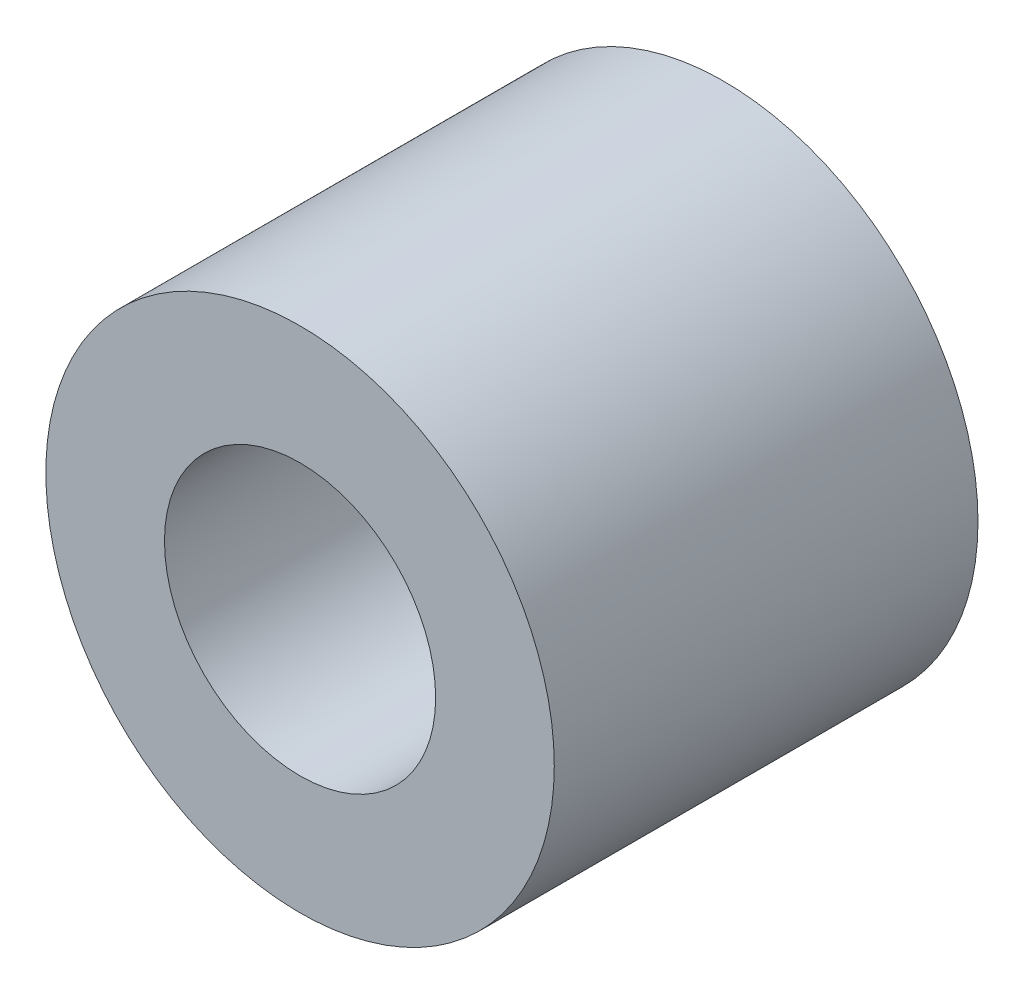
ISO-10303-21;
HEADER;
FILE_DESCRIPTION(('STEP AP214'),'2;1');
FILE_NAME('part.step','',(''),(''),'','','');
FILE_SCHEMA(('AUTOMOTIVE_DESIGN { 1 0 10303 214 1 1 1 1 }'));
ENDSEC;
DATA;
#1=APPLICATION_CONTEXT('core data for automotive mechanical design processes');
#2=APPLICATION_PROTOCOL_DEFINITION('international standard','automotive_design',2000,#1);
#3=PRODUCT_CONTEXT('',#1,'mechanical');
#4=PRODUCT('Part','Part','',(#3));
#5=PRODUCT_RELATED_PRODUCT_CATEGORY('part','',(#4));
#6=PRODUCT_DEFINITION_FORMATION('','',#4);
#7=PRODUCT_DEFINITION_CONTEXT('part definition',#1,'design');
#8=PRODUCT_DEFINITION('design','',#6,#7);
#9=PRODUCT_DEFINITION_SHAPE('','',#8);
#10=(LENGTH_UNIT() NAMED_UNIT(*) SI_UNIT(.MILLI.,.METRE.));
#11=(NAMED_UNIT(*) PLANE_ANGLE_UNIT() SI_UNIT($,.RADIAN.));
#12=(NAMED_UNIT(*) SI_UNIT($,.STERADIAN.) SOLID_ANGLE_UNIT());
#13=UNCERTAINTY_MEASURE_WITH_UNIT(LENGTH_MEASURE(1.E-05),#10,'distance_accuracy_value','');
#14=(GEOMETRIC_REPRESENTATION_CONTEXT(3) GLOBAL_UNCERTAINTY_ASSIGNED_CONTEXT((#13)) GLOBAL_UNIT_ASSIGNED_CONTEXT((#10,
#11,#12)) REPRESENTATION_CONTEXT('',''));
#15=CARTESIAN_POINT('',(0.,0.,0.));
#16=DIRECTION('',(0.,0.,1.));
#17=DIRECTION('',(1.,0.,0.));
#18=AXIS2_PLACEMENT_3D('',#15,#16,#17);
#19=CARTESIAN_POINT('',(0.,0.,5.));
#20=DIRECTION('',(0.,0.,1.));
#21=DIRECTION('',(1.,0.,0.));
#22=AXIS2_PLACEMENT_3D('',#19,#20,#21);
#23=PLANE('',#22);
#24=CARTESIAN_POINT('',(0.,0.,5.));
#25=DIRECTION('',(0.,0.,1.));
#26=DIRECTION('',(1.,0.,0.));
#27=AXIS2_PLACEMENT_3D('',#24,#25,#26);
#28=CIRCLE('',#27,3.);
#29=CARTESIAN_POINT('',(3.,0.,5.));
#30=VERTEX_POINT('',#29);
#31=EDGE_CURVE('E10',#30,#30,#28,.T.);
#32=ORIENTED_EDGE('',*,*,#31,.T.);
#33=EDGE_LOOP('',(#32));
#34=FACE_BOUND('',#33,.T.);
#35=CARTESIAN_POINT('',(0.,0.,5.));
#36=DIRECTION('',(0.,0.,1.));
#37=DIRECTION('',(1.,0.,0.));
#38=AXIS2_PLACEMENT_3D('',#35,#36,#37);
#39=CIRCLE('',#38,1.6);
#40=CARTESIAN_POINT('',(1.6,0.,5.));
#41=VERTEX_POINT('',#40);
#42=EDGE_CURVE('E42',#41,#41,#39,.T.);
#43=ORIENTED_EDGE('',*,*,#42,.F.);
#44=EDGE_LOOP('',(#43));
#45=FACE_BOUND('',#44,.T.);
#46=ADVANCED_FACE('F31',(#34,#45),#23,.T.);
#47=CARTESIAN_POINT('',(0.,0.,0.));
#48=DIRECTION('',(0.,0.,1.));
#49=DIRECTION('',(1.,0.,0.));
#50=AXIS2_PLACEMENT_3D('',#47,#48,#49);
#51=PLANE('',#50);
#52=CARTESIAN_POINT('',(0.,0.,0.));
#53=DIRECTION('',(0.,0.,1.));
#54=DIRECTION('',(1.,0.,0.));
#55=AXIS2_PLACEMENT_3D('',#52,#53,#54);
#56=CIRCLE('',#55,3.);
#57=CARTESIAN_POINT('',(3.,0.,0.));
#58=VERTEX_POINT('',#57);
#59=EDGE_CURVE('E35',#58,#58,#56,.T.);
#60=ORIENTED_EDGE('',*,*,#59,.F.);
#61=EDGE_LOOP('',(#60));
#62=FACE_BOUND('',#61,.T.);
#63=CARTESIAN_POINT('',(0.,0.,0.));
#64=DIRECTION('',(0.,0.,1.));
#65=DIRECTION('',(1.,0.,0.));
#66=AXIS2_PLACEMENT_3D('',#63,#64,#65);
#67=CIRCLE('',#66,1.6);
#68=CARTESIAN_POINT('',(1.6,0.,0.));
#69=VERTEX_POINT('',#68);
#70=EDGE_CURVE('E44',#69,#69,#67,.T.);
#71=ORIENTED_EDGE('',*,*,#70,.T.);
#72=EDGE_LOOP('',(#71));
#73=FACE_BOUND('',#72,.T.);
#74=ADVANCED_FACE('F54',(#62,#73),#51,.F.);
#75=CARTESIAN_POINT('',(0.,0.,5.));
#76=DIRECTION('',(0.,0.,-1.));
#77=DIRECTION('',(-1.,0.,0.));
#78=AXIS2_PLACEMENT_3D('',#75,#76,#77);
#79=CYLINDRICAL_SURFACE('',#78,3.);
#80=ORIENTED_EDGE('',*,*,#31,.F.);
#81=EDGE_LOOP('',(#80));
#82=FACE_BOUND('',#81,.T.);
#83=ORIENTED_EDGE('',*,*,#59,.T.);
#84=EDGE_LOOP('',(#83));
#85=FACE_BOUND('',#84,.T.);
#86=ADVANCED_FACE('F33',(#82,#85),#79,.T.);
#87=CARTESIAN_POINT('',(0.,0.,5.));
#88=DIRECTION('',(0.,0.,-1.));
#89=DIRECTION('',(-1.,0.,0.));
#90=AXIS2_PLACEMENT_3D('',#87,#88,#89);
#91=CYLINDRICAL_SURFACE('',#90,1.6);
#92=ORIENTED_EDGE('',*,*,#42,.T.);
#93=EDGE_LOOP('',(#92));
#94=FACE_BOUND('',#93,.T.);
#95=ORIENTED_EDGE('',*,*,#70,.F.);
#96=EDGE_LOOP('',(#95));
#97=FACE_BOUND('',#96,.T.);
#98=ADVANCED_FACE('F50',(#94,#97),#91,.F.);
#99=CLOSED_SHELL('',(#46,#74,#86,#98));
#100=MANIFOLD_SOLID_BREP('B2',#99);
#101=ADVANCED_BREP_SHAPE_REPRESENTATION('',(#18,#100),#14);
#102=SHAPE_DEFINITION_REPRESENTATION(#9,#101);
ENDSEC;
END-ISO-10303-21;
